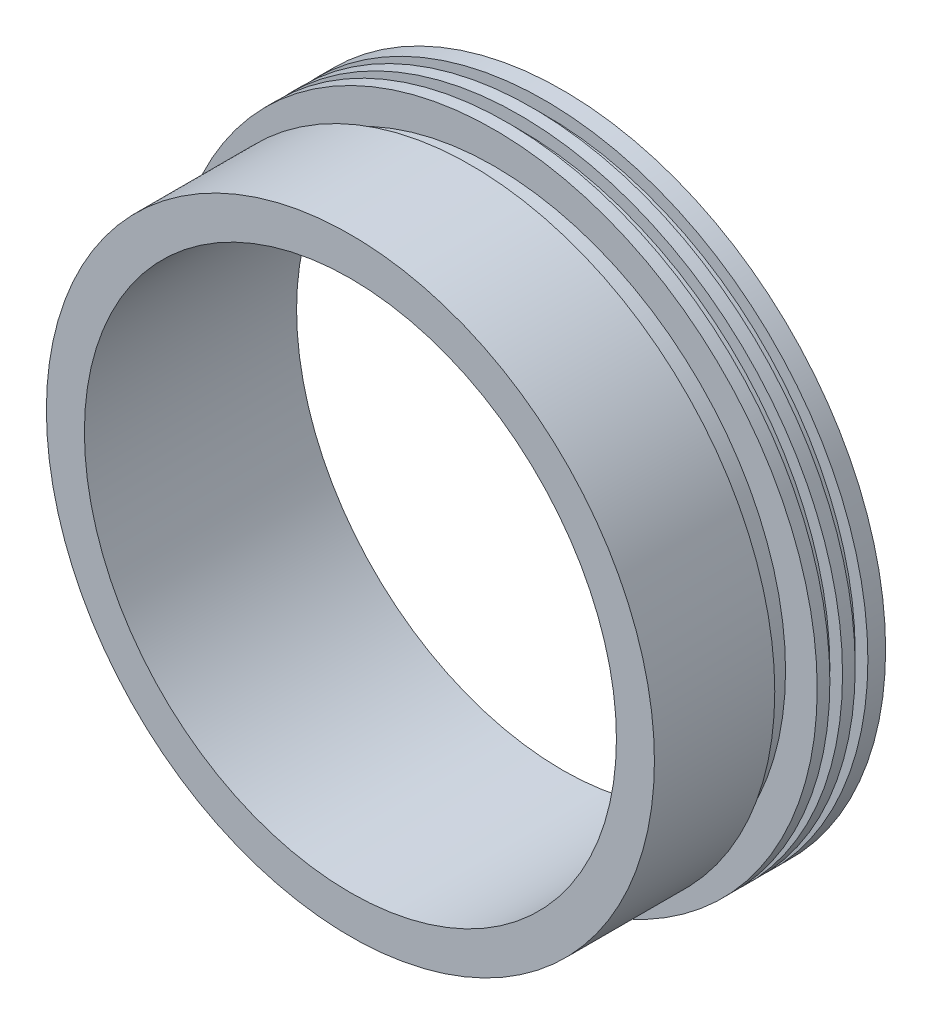
ISO-10303-21;
HEADER;
FILE_DESCRIPTION(('STEP AP214'),'2;1');
FILE_NAME('part.step','',(''),(''),'','','');
FILE_SCHEMA(('AUTOMOTIVE_DESIGN { 1 0 10303 214 1 1 1 1 }'));
ENDSEC;
DATA;
#1=APPLICATION_CONTEXT('core data for automotive mechanical design processes');
#2=APPLICATION_PROTOCOL_DEFINITION('international standard','automotive_design',2000,#1);
#3=PRODUCT_CONTEXT('',#1,'mechanical');
#4=PRODUCT('Part','Part','',(#3));
#5=PRODUCT_RELATED_PRODUCT_CATEGORY('part','',(#4));
#6=PRODUCT_DEFINITION_FORMATION('','',#4);
#7=PRODUCT_DEFINITION_CONTEXT('part definition',#1,'design');
#8=PRODUCT_DEFINITION('design','',#6,#7);
#9=PRODUCT_DEFINITION_SHAPE('','',#8);
#10=(LENGTH_UNIT() NAMED_UNIT(*) SI_UNIT(.MILLI.,.METRE.));
#11=(NAMED_UNIT(*) PLANE_ANGLE_UNIT() SI_UNIT($,.RADIAN.));
#12=(NAMED_UNIT(*) SI_UNIT($,.STERADIAN.) SOLID_ANGLE_UNIT());
#13=UNCERTAINTY_MEASURE_WITH_UNIT(LENGTH_MEASURE(1.E-05),#10,'distance_accuracy_value','');
#14=(GEOMETRIC_REPRESENTATION_CONTEXT(3) GLOBAL_UNCERTAINTY_ASSIGNED_CONTEXT((#13)) GLOBAL_UNIT_ASSIGNED_CONTEXT((#10,
#11,#12)) REPRESENTATION_CONTEXT('',''));
#15=CARTESIAN_POINT('',(0.,0.,0.));
#16=DIRECTION('',(0.,0.,1.));
#17=DIRECTION('',(1.,0.,0.));
#18=AXIS2_PLACEMENT_3D('',#15,#16,#17);
#19=CARTESIAN_POINT('',(0.,0.,0.));
#20=DIRECTION('',(0.,0.,1.));
#21=DIRECTION('',(1.,0.,0.));
#22=AXIS2_PLACEMENT_3D('',#19,#20,#21);
#23=PLANE('',#22);
#24=CARTESIAN_POINT('',(-42.,0.,0.));
#25=DIRECTION('',(0.,0.,1.));
#26=DIRECTION('',(1.,0.,0.));
#27=AXIS2_PLACEMENT_3D('',#24,#25,#26);
#28=CIRCLE('',#27,48.);
#29=CARTESIAN_POINT('',(6.,0.,0.));
#30=VERTEX_POINT('',#29);
#31=EDGE_CURVE('E67',#30,#30,#28,.T.);
#32=ORIENTED_EDGE('',*,*,#31,.T.);
#33=EDGE_LOOP('',(#32));
#34=FACE_BOUND('',#33,.T.);
#35=CARTESIAN_POINT('',(-42.,0.,0.));
#36=DIRECTION('',(0.,0.,1.));
#37=DIRECTION('',(1.,0.,0.));
#38=AXIS2_PLACEMENT_3D('',#35,#36,#37);
#39=CIRCLE('',#38,42.);
#40=CARTESIAN_POINT('',(0.,0.,0.));
#41=VERTEX_POINT('',#40);
#42=EDGE_CURVE('E10',#41,#41,#39,.T.);
#43=ORIENTED_EDGE('',*,*,#42,.F.);
#44=EDGE_LOOP('',(#43));
#45=FACE_BOUND('',#44,.T.);
#46=ADVANCED_FACE('F15',(#34,#45),#23,.T.);
#47=CARTESIAN_POINT('',(-42.,0.,0.));
#48=DIRECTION('',(0.,0.,1.));
#49=DIRECTION('',(1.,0.,0.));
#50=AXIS2_PLACEMENT_3D('',#47,#48,#49);
#51=CYLINDRICAL_SURFACE('',#50,42.);
#52=ORIENTED_EDGE('',*,*,#42,.T.);
#53=EDGE_LOOP('',(#52));
#54=FACE_BOUND('',#53,.T.);
#55=CARTESIAN_POINT('',(-42.,0.,-33.5));
#56=DIRECTION('',(0.,0.,1.));
#57=DIRECTION('',(1.,0.,0.));
#58=AXIS2_PLACEMENT_3D('',#55,#56,#57);
#59=CIRCLE('',#58,42.);
#60=CARTESIAN_POINT('',(0.,0.,-33.5));
#61=VERTEX_POINT('',#60);
#62=EDGE_CURVE('E21',#61,#61,#59,.T.);
#63=ORIENTED_EDGE('',*,*,#62,.F.);
#64=EDGE_LOOP('',(#63));
#65=FACE_BOUND('',#64,.T.);
#66=ADVANCED_FACE('F87',(#54,#65),#51,.F.);
#67=CARTESIAN_POINT('',(-1.14870394767881E-13,0.,-33.5));
#68=DIRECTION('',(0.,0.,-1.));
#69=DIRECTION('',(-1.,0.,0.));
#70=AXIS2_PLACEMENT_3D('',#67,#68,#69);
#71=PLANE('',#70);
#72=ORIENTED_EDGE('',*,*,#62,.T.);
#73=EDGE_LOOP('',(#72));
#74=FACE_BOUND('',#73,.T.);
#75=CARTESIAN_POINT('',(-42.,0.,-33.5));
#76=DIRECTION('',(0.,0.,1.));
#77=DIRECTION('',(1.,0.,0.));
#78=AXIS2_PLACEMENT_3D('',#75,#76,#77);
#79=CIRCLE('',#78,51.);
#80=CARTESIAN_POINT('',(8.99999999999999,0.,-33.5));
#81=VERTEX_POINT('',#80);
#82=EDGE_CURVE('E25',#81,#81,#79,.T.);
#83=ORIENTED_EDGE('',*,*,#82,.F.);
#84=EDGE_LOOP('',(#83));
#85=FACE_BOUND('',#84,.T.);
#86=ADVANCED_FACE('F92',(#74,#85),#71,.T.);
#87=CARTESIAN_POINT('',(-42.,0.,0.));
#88=DIRECTION('',(0.,0.,1.));
#89=DIRECTION('',(1.,0.,0.));
#90=AXIS2_PLACEMENT_3D('',#87,#88,#89);
#91=CYLINDRICAL_SURFACE('',#90,51.);
#92=ORIENTED_EDGE('',*,*,#82,.T.);
#93=EDGE_LOOP('',(#92));
#94=FACE_BOUND('',#93,.T.);
#95=CARTESIAN_POINT('',(-42.,0.,-30.7));
#96=DIRECTION('',(0.,0.,1.));
#97=DIRECTION('',(1.,0.,0.));
#98=AXIS2_PLACEMENT_3D('',#95,#96,#97);
#99=CIRCLE('',#98,51.);
#100=CARTESIAN_POINT('',(8.99999999999999,0.,-30.7));
#101=VERTEX_POINT('',#100);
#102=EDGE_CURVE('E29',#101,#101,#99,.T.);
#103=ORIENTED_EDGE('',*,*,#102,.F.);
#104=EDGE_LOOP('',(#103));
#105=FACE_BOUND('',#104,.T.);
#106=ADVANCED_FACE('F97',(#94,#105),#91,.T.);
#107=CARTESIAN_POINT('',(8.99999999999989,0.,-30.7));
#108=DIRECTION('',(0.,0.,1.));
#109=DIRECTION('',(1.,0.,0.));
#110=AXIS2_PLACEMENT_3D('',#107,#108,#109);
#111=PLANE('',#110);
#112=ORIENTED_EDGE('',*,*,#102,.T.);
#113=EDGE_LOOP('',(#112));
#114=FACE_BOUND('',#113,.T.);
#115=CARTESIAN_POINT('',(-42.,0.,-30.7));
#116=DIRECTION('',(0.,0.,1.));
#117=DIRECTION('',(1.,0.,0.));
#118=AXIS2_PLACEMENT_3D('',#115,#116,#117);
#119=CIRCLE('',#118,49.);
#120=CARTESIAN_POINT('',(7.,0.,-30.7));
#121=VERTEX_POINT('',#120);
#122=EDGE_CURVE('E34',#121,#121,#119,.T.);
#123=ORIENTED_EDGE('',*,*,#122,.F.);
#124=EDGE_LOOP('',(#123));
#125=FACE_BOUND('',#124,.T.);
#126=ADVANCED_FACE('F103',(#114,#125),#111,.T.);
#127=CARTESIAN_POINT('',(-42.,0.,0.));
#128=DIRECTION('',(0.,0.,1.));
#129=DIRECTION('',(1.,0.,0.));
#130=AXIS2_PLACEMENT_3D('',#127,#128,#129);
#131=CYLINDRICAL_SURFACE('',#130,49.);
#132=ORIENTED_EDGE('',*,*,#122,.T.);
#133=EDGE_LOOP('',(#132));
#134=FACE_BOUND('',#133,.T.);
#135=CARTESIAN_POINT('',(-42.,0.,-28.7));
#136=DIRECTION('',(0.,0.,1.));
#137=DIRECTION('',(1.,0.,0.));
#138=AXIS2_PLACEMENT_3D('',#135,#136,#137);
#139=CIRCLE('',#138,49.);
#140=CARTESIAN_POINT('',(7.,0.,-28.7));
#141=VERTEX_POINT('',#140);
#142=EDGE_CURVE('E37',#141,#141,#139,.T.);
#143=ORIENTED_EDGE('',*,*,#142,.F.);
#144=EDGE_LOOP('',(#143));
#145=FACE_BOUND('',#144,.T.);
#146=ADVANCED_FACE('F107',(#134,#145),#131,.T.);
#147=CARTESIAN_POINT('',(6.99999999999989,0.,-28.7));
#148=DIRECTION('',(0.,0.,-1.));
#149=DIRECTION('',(-1.,0.,0.));
#150=AXIS2_PLACEMENT_3D('',#147,#148,#149);
#151=PLANE('',#150);
#152=ORIENTED_EDGE('',*,*,#142,.T.);
#153=EDGE_LOOP('',(#152));
#154=FACE_BOUND('',#153,.T.);
#155=CARTESIAN_POINT('',(-42.,0.,-28.7));
#156=DIRECTION('',(0.,0.,1.));
#157=DIRECTION('',(1.,0.,0.));
#158=AXIS2_PLACEMENT_3D('',#155,#156,#157);
#159=CIRCLE('',#158,51.);
#160=CARTESIAN_POINT('',(8.99999999999999,0.,-28.7));
#161=VERTEX_POINT('',#160);
#162=EDGE_CURVE('E40',#161,#161,#159,.T.);
#163=ORIENTED_EDGE('',*,*,#162,.F.);
#164=EDGE_LOOP('',(#163));
#165=FACE_BOUND('',#164,.T.);
#166=ADVANCED_FACE('F111',(#154,#165),#151,.T.);
#167=CARTESIAN_POINT('',(-42.,0.,0.));
#168=DIRECTION('',(0.,0.,1.));
#169=DIRECTION('',(1.,0.,0.));
#170=AXIS2_PLACEMENT_3D('',#167,#168,#169);
#171=CYLINDRICAL_SURFACE('',#170,51.);
#172=ORIENTED_EDGE('',*,*,#162,.T.);
#173=EDGE_LOOP('',(#172));
#174=FACE_BOUND('',#173,.T.);
#175=CARTESIAN_POINT('',(-42.,0.,-26.7));
#176=DIRECTION('',(0.,0.,1.));
#177=DIRECTION('',(1.,0.,0.));
#178=AXIS2_PLACEMENT_3D('',#175,#176,#177);
#179=CIRCLE('',#178,51.);
#180=CARTESIAN_POINT('',(8.99999999999999,0.,-26.7));
#181=VERTEX_POINT('',#180);
#182=EDGE_CURVE('E43',#181,#181,#179,.T.);
#183=ORIENTED_EDGE('',*,*,#182,.F.);
#184=EDGE_LOOP('',(#183));
#185=FACE_BOUND('',#184,.T.);
#186=ADVANCED_FACE('F115',(#174,#185),#171,.T.);
#187=CARTESIAN_POINT('',(8.99999999999989,0.,-26.7));
#188=DIRECTION('',(0.,0.,1.));
#189=DIRECTION('',(1.,0.,0.));
#190=AXIS2_PLACEMENT_3D('',#187,#188,#189);
#191=PLANE('',#190);
#192=ORIENTED_EDGE('',*,*,#182,.T.);
#193=EDGE_LOOP('',(#192));
#194=FACE_BOUND('',#193,.T.);
#195=CARTESIAN_POINT('',(-42.,0.,-26.7));
#196=DIRECTION('',(0.,0.,1.));
#197=DIRECTION('',(1.,0.,0.));
#198=AXIS2_PLACEMENT_3D('',#195,#196,#197);
#199=CIRCLE('',#198,49.);
#200=CARTESIAN_POINT('',(7.,0.,-26.7));
#201=VERTEX_POINT('',#200);
#202=EDGE_CURVE('E46',#201,#201,#199,.T.);
#203=ORIENTED_EDGE('',*,*,#202,.F.);
#204=EDGE_LOOP('',(#203));
#205=FACE_BOUND('',#204,.T.);
#206=ADVANCED_FACE('F119',(#194,#205),#191,.T.);
#207=CARTESIAN_POINT('',(-42.,0.,0.));
#208=DIRECTION('',(0.,0.,1.));
#209=DIRECTION('',(1.,0.,0.));
#210=AXIS2_PLACEMENT_3D('',#207,#208,#209);
#211=CYLINDRICAL_SURFACE('',#210,49.);
#212=ORIENTED_EDGE('',*,*,#202,.T.);
#213=EDGE_LOOP('',(#212));
#214=FACE_BOUND('',#213,.T.);
#215=CARTESIAN_POINT('',(-42.,0.,-24.7));
#216=DIRECTION('',(0.,0.,1.));
#217=DIRECTION('',(1.,0.,0.));
#218=AXIS2_PLACEMENT_3D('',#215,#216,#217);
#219=CIRCLE('',#218,49.);
#220=CARTESIAN_POINT('',(7.,0.,-24.7));
#221=VERTEX_POINT('',#220);
#222=EDGE_CURVE('E49',#221,#221,#219,.T.);
#223=ORIENTED_EDGE('',*,*,#222,.F.);
#224=EDGE_LOOP('',(#223));
#225=FACE_BOUND('',#224,.T.);
#226=ADVANCED_FACE('F123',(#214,#225),#211,.T.);
#227=CARTESIAN_POINT('',(6.99999999999989,0.,-24.7));
#228=DIRECTION('',(0.,0.,-1.));
#229=DIRECTION('',(-1.,0.,0.));
#230=AXIS2_PLACEMENT_3D('',#227,#228,#229);
#231=PLANE('',#230);
#232=ORIENTED_EDGE('',*,*,#222,.T.);
#233=EDGE_LOOP('',(#232));
#234=FACE_BOUND('',#233,.T.);
#235=CARTESIAN_POINT('',(-42.,0.,-24.7));
#236=DIRECTION('',(0.,0.,1.));
#237=DIRECTION('',(1.,0.,0.));
#238=AXIS2_PLACEMENT_3D('',#235,#236,#237);
#239=CIRCLE('',#238,51.);
#240=CARTESIAN_POINT('',(8.99999999999999,0.,-24.7));
#241=VERTEX_POINT('',#240);
#242=EDGE_CURVE('E52',#241,#241,#239,.T.);
#243=ORIENTED_EDGE('',*,*,#242,.F.);
#244=EDGE_LOOP('',(#243));
#245=FACE_BOUND('',#244,.T.);
#246=ADVANCED_FACE('F127',(#234,#245),#231,.T.);
#247=CARTESIAN_POINT('',(-42.,0.,0.));
#248=DIRECTION('',(0.,0.,1.));
#249=DIRECTION('',(1.,0.,0.));
#250=AXIS2_PLACEMENT_3D('',#247,#248,#249);
#251=CYLINDRICAL_SURFACE('',#250,51.);
#252=ORIENTED_EDGE('',*,*,#242,.T.);
#253=EDGE_LOOP('',(#252));
#254=FACE_BOUND('',#253,.T.);
#255=CARTESIAN_POINT('',(-42.,0.,-22.7));
#256=DIRECTION('',(0.,0.,1.));
#257=DIRECTION('',(1.,0.,0.));
#258=AXIS2_PLACEMENT_3D('',#255,#256,#257);
#259=CIRCLE('',#258,51.);
#260=CARTESIAN_POINT('',(8.99999999999999,0.,-22.7));
#261=VERTEX_POINT('',#260);
#262=EDGE_CURVE('E55',#261,#261,#259,.T.);
#263=ORIENTED_EDGE('',*,*,#262,.F.);
#264=EDGE_LOOP('',(#263));
#265=FACE_BOUND('',#264,.T.);
#266=ADVANCED_FACE('F131',(#254,#265),#251,.T.);
#267=CARTESIAN_POINT('',(8.99999999999989,0.,-22.7));
#268=DIRECTION('',(0.,0.,1.));
#269=DIRECTION('',(1.,0.,0.));
#270=AXIS2_PLACEMENT_3D('',#267,#268,#269);
#271=PLANE('',#270);
#272=ORIENTED_EDGE('',*,*,#262,.T.);
#273=EDGE_LOOP('',(#272));
#274=FACE_BOUND('',#273,.T.);
#275=CARTESIAN_POINT('',(-42.,0.,-22.7));
#276=DIRECTION('',(0.,0.,1.));
#277=DIRECTION('',(1.,0.,0.));
#278=AXIS2_PLACEMENT_3D('',#275,#276,#277);
#279=CIRCLE('',#278,46.);
#280=CARTESIAN_POINT('',(4.,0.,-22.7));
#281=VERTEX_POINT('',#280);
#282=EDGE_CURVE('E58',#281,#281,#279,.T.);
#283=ORIENTED_EDGE('',*,*,#282,.F.);
#284=EDGE_LOOP('',(#283));
#285=FACE_BOUND('',#284,.T.);
#286=ADVANCED_FACE('F135',(#274,#285),#271,.T.);
#287=CARTESIAN_POINT('',(-42.,0.,0.));
#288=DIRECTION('',(0.,0.,1.));
#289=DIRECTION('',(1.,0.,0.));
#290=AXIS2_PLACEMENT_3D('',#287,#288,#289);
#291=CYLINDRICAL_SURFACE('',#290,46.);
#292=ORIENTED_EDGE('',*,*,#282,.T.);
#293=EDGE_LOOP('',(#292));
#294=FACE_BOUND('',#293,.T.);
#295=CARTESIAN_POINT('',(-42.,0.,-19.));
#296=DIRECTION('',(0.,0.,1.));
#297=DIRECTION('',(1.,0.,0.));
#298=AXIS2_PLACEMENT_3D('',#295,#296,#297);
#299=CIRCLE('',#298,46.);
#300=CARTESIAN_POINT('',(4.,0.,-19.));
#301=VERTEX_POINT('',#300);
#302=EDGE_CURVE('E61',#301,#301,#299,.T.);
#303=ORIENTED_EDGE('',*,*,#302,.F.);
#304=EDGE_LOOP('',(#303));
#305=FACE_BOUND('',#304,.T.);
#306=ADVANCED_FACE('F83',(#294,#305),#291,.T.);
#307=CARTESIAN_POINT('',(3.99999999999988,0.,-19.));
#308=DIRECTION('',(0.,0.,-1.));
#309=DIRECTION('',(-1.,0.,0.));
#310=AXIS2_PLACEMENT_3D('',#307,#308,#309);
#311=PLANE('',#310);
#312=ORIENTED_EDGE('',*,*,#302,.T.);
#313=EDGE_LOOP('',(#312));
#314=FACE_BOUND('',#313,.T.);
#315=CARTESIAN_POINT('',(-42.,0.,-19.));
#316=DIRECTION('',(0.,0.,1.));
#317=DIRECTION('',(1.,0.,0.));
#318=AXIS2_PLACEMENT_3D('',#315,#316,#317);
#319=CIRCLE('',#318,48.);
#320=CARTESIAN_POINT('',(6.,0.,-19.));
#321=VERTEX_POINT('',#320);
#322=EDGE_CURVE('E64',#321,#321,#319,.T.);
#323=ORIENTED_EDGE('',*,*,#322,.F.);
#324=EDGE_LOOP('',(#323));
#325=FACE_BOUND('',#324,.T.);
#326=ADVANCED_FACE('F75',(#314,#325),#311,.T.);
#327=CARTESIAN_POINT('',(-42.,0.,0.));
#328=DIRECTION('',(0.,0.,1.));
#329=DIRECTION('',(1.,0.,0.));
#330=AXIS2_PLACEMENT_3D('',#327,#328,#329);
#331=CYLINDRICAL_SURFACE('',#330,48.);
#332=ORIENTED_EDGE('',*,*,#322,.T.);
#333=EDGE_LOOP('',(#332));
#334=FACE_BOUND('',#333,.T.);
#335=ORIENTED_EDGE('',*,*,#31,.F.);
#336=EDGE_LOOP('',(#335));
#337=FACE_BOUND('',#336,.T.);
#338=ADVANCED_FACE('F73',(#334,#337),#331,.T.);
#339=CLOSED_SHELL('',(#46,#66,#86,#106,#126,#146,#166,#186,#206,#226,#246,#266,#286,#306,#326,#338));
#340=MANIFOLD_SOLID_BREP('B1',#339);
#341=ADVANCED_BREP_SHAPE_REPRESENTATION('',(#18,#340),#14);
#342=SHAPE_DEFINITION_REPRESENTATION(#9,#341);
ENDSEC;
END-ISO-10303-21;
